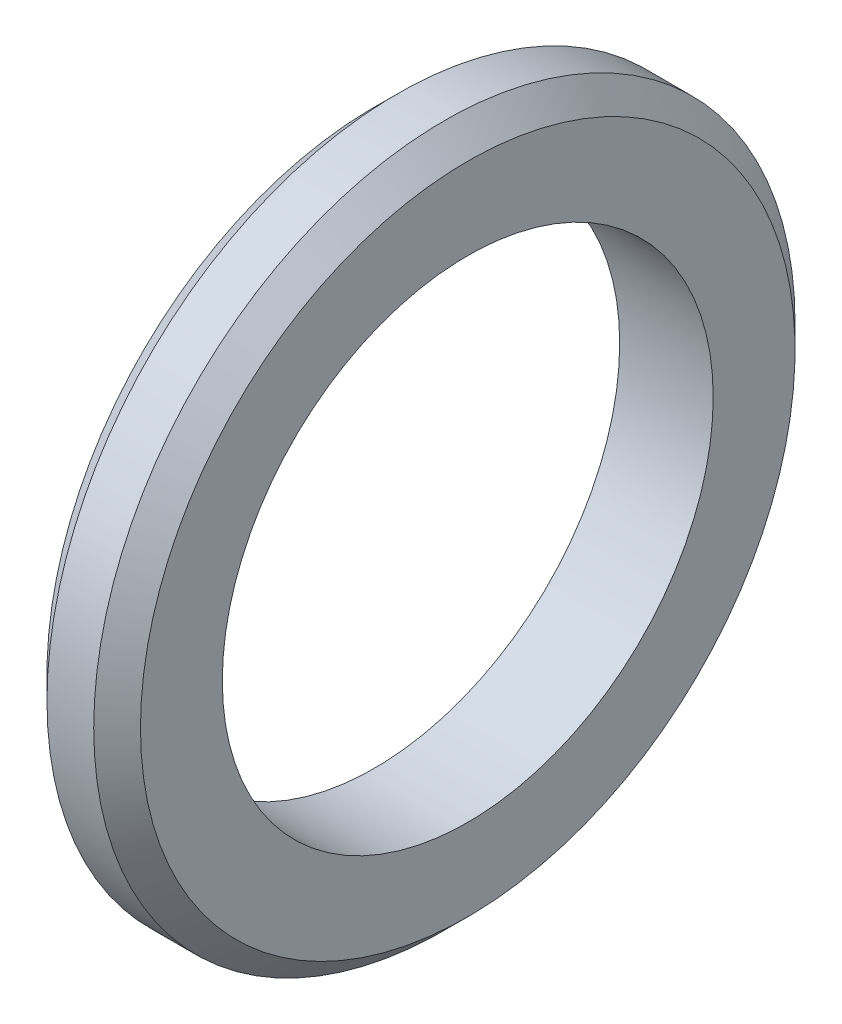
ISO-10303-21;
HEADER;
FILE_DESCRIPTION(('STEP AP214'),'2;1');
FILE_NAME('part.step','',(''),(''),'','','');
FILE_SCHEMA(('AUTOMOTIVE_DESIGN { 1 0 10303 214 1 1 1 1 }'));
ENDSEC;
DATA;
#1=APPLICATION_CONTEXT('core data for automotive mechanical design processes');
#2=APPLICATION_PROTOCOL_DEFINITION('international standard','automotive_design',2000,#1);
#3=PRODUCT_CONTEXT('',#1,'mechanical');
#4=PRODUCT('Part','Part','',(#3));
#5=PRODUCT_RELATED_PRODUCT_CATEGORY('part','',(#4));
#6=PRODUCT_DEFINITION_FORMATION('','',#4);
#7=PRODUCT_DEFINITION_CONTEXT('part definition',#1,'design');
#8=PRODUCT_DEFINITION('design','',#6,#7);
#9=PRODUCT_DEFINITION_SHAPE('','',#8);
#10=(LENGTH_UNIT() NAMED_UNIT(*) SI_UNIT(.MILLI.,.METRE.));
#11=(NAMED_UNIT(*) PLANE_ANGLE_UNIT() SI_UNIT($,.RADIAN.));
#12=(NAMED_UNIT(*) SI_UNIT($,.STERADIAN.) SOLID_ANGLE_UNIT());
#13=UNCERTAINTY_MEASURE_WITH_UNIT(LENGTH_MEASURE(1.E-05),#10,'distance_accuracy_value','');
#14=(GEOMETRIC_REPRESENTATION_CONTEXT(3) GLOBAL_UNCERTAINTY_ASSIGNED_CONTEXT((#13)) GLOBAL_UNIT_ASSIGNED_CONTEXT((#10,
#11,#12)) REPRESENTATION_CONTEXT('',''));
#15=CARTESIAN_POINT('',(0.,0.,0.));
#16=DIRECTION('',(0.,0.,1.));
#17=DIRECTION('',(1.,0.,0.));
#18=AXIS2_PLACEMENT_3D('',#15,#16,#17);
#19=CARTESIAN_POINT('',(25.4,-177.8254,177.8254));
#20=DIRECTION('',(1.,0.,0.));
#21=DIRECTION('',(0.,0.,-1.));
#22=AXIS2_PLACEMENT_3D('',#19,#20,#21);
#23=PLANE('',#22);
#24=CARTESIAN_POINT('',(25.4,0.,0.));
#25=DIRECTION('',(1.,0.,0.));
#26=DIRECTION('',(0.,0.,-1.));
#27=AXIS2_PLACEMENT_3D('',#24,#25,#26);
#28=CIRCLE('',#27,133.35);
#29=CARTESIAN_POINT('',(25.4,0.,-133.35));
#30=VERTEX_POINT('',#29);
#31=EDGE_CURVE('E16',#30,#30,#28,.T.);
#32=ORIENTED_EDGE('',*,*,#31,.F.);
#33=EDGE_LOOP('',(#32));
#34=FACE_BOUND('',#33,.T.);
#35=CARTESIAN_POINT('',(25.4,0.,0.));
#36=DIRECTION('',(-1.,0.,0.));
#37=DIRECTION('',(0.,0.,1.));
#38=AXIS2_PLACEMENT_3D('',#35,#36,#37);
#39=CIRCLE('',#38,177.8);
#40=CARTESIAN_POINT('',(25.4,0.,177.8));
#41=VERTEX_POINT('',#40);
#42=EDGE_CURVE('E32',#41,#41,#39,.T.);
#43=ORIENTED_EDGE('',*,*,#42,.F.);
#44=EDGE_LOOP('',(#43));
#45=FACE_BOUND('',#44,.T.);
#46=ADVANCED_FACE('F12',(#34,#45),#23,.T.);
#47=CARTESIAN_POINT('',(-25.4,0.,0.));
#48=DIRECTION('',(1.,0.,0.));
#49=DIRECTION('',(0.,0.,-1.));
#50=AXIS2_PLACEMENT_3D('',#47,#48,#49);
#51=CYLINDRICAL_SURFACE('',#50,133.35);
#52=CARTESIAN_POINT('',(-25.4,0.,0.));
#53=DIRECTION('',(1.,0.,0.));
#54=DIRECTION('',(0.,0.,-1.));
#55=AXIS2_PLACEMENT_3D('',#52,#53,#54);
#56=CIRCLE('',#55,133.35);
#57=CARTESIAN_POINT('',(-25.4,0.,-133.35));
#58=VERTEX_POINT('',#57);
#59=EDGE_CURVE('E29',#58,#58,#56,.T.);
#60=ORIENTED_EDGE('',*,*,#59,.F.);
#61=EDGE_LOOP('',(#60));
#62=FACE_BOUND('',#61,.T.);
#63=ORIENTED_EDGE('',*,*,#31,.T.);
#64=EDGE_LOOP('',(#63));
#65=FACE_BOUND('',#64,.T.);
#66=ADVANCED_FACE('F39',(#62,#65),#51,.F.);
#67=CARTESIAN_POINT('',(12.7,0.,0.));
#68=DIRECTION('',(-1.,0.,0.));
#69=DIRECTION('',(0.,0.,1.));
#70=AXIS2_PLACEMENT_3D('',#67,#68,#69);
#71=CONICAL_SURFACE('',#70,190.5,0.78539816339745);
#72=CARTESIAN_POINT('',(12.7,0.,0.));
#73=DIRECTION('',(-1.,0.,0.));
#74=DIRECTION('',(0.,0.,1.));
#75=AXIS2_PLACEMENT_3D('',#72,#73,#74);
#76=CIRCLE('',#75,190.5);
#77=CARTESIAN_POINT('',(12.7,0.,190.5));
#78=VERTEX_POINT('',#77);
#79=EDGE_CURVE('E25',#78,#78,#76,.T.);
#80=ORIENTED_EDGE('',*,*,#79,.F.);
#81=EDGE_LOOP('',(#80));
#82=FACE_BOUND('',#81,.T.);
#83=ORIENTED_EDGE('',*,*,#42,.T.);
#84=EDGE_LOOP('',(#83));
#85=FACE_BOUND('',#84,.T.);
#86=ADVANCED_FACE('F48',(#82,#85),#71,.T.);
#87=CARTESIAN_POINT('',(-25.4,-177.8254,-177.8254));
#88=DIRECTION('',(-1.,0.,0.));
#89=DIRECTION('',(0.,0.,1.));
#90=AXIS2_PLACEMENT_3D('',#87,#88,#89);
#91=PLANE('',#90);
#92=ORIENTED_EDGE('',*,*,#59,.T.);
#93=EDGE_LOOP('',(#92));
#94=FACE_BOUND('',#93,.T.);
#95=CARTESIAN_POINT('',(-25.4,0.,0.));
#96=DIRECTION('',(1.,0.,0.));
#97=DIRECTION('',(0.,0.,-1.));
#98=AXIS2_PLACEMENT_3D('',#95,#96,#97);
#99=CIRCLE('',#98,177.8);
#100=CARTESIAN_POINT('',(-25.4,0.,-177.8));
#101=VERTEX_POINT('',#100);
#102=EDGE_CURVE('E20',#101,#101,#99,.T.);
#103=ORIENTED_EDGE('',*,*,#102,.F.);
#104=EDGE_LOOP('',(#103));
#105=FACE_BOUND('',#104,.T.);
#106=ADVANCED_FACE('F57',(#94,#105),#91,.T.);
#107=CARTESIAN_POINT('',(12.7,0.,0.));
#108=DIRECTION('',(-1.,0.,0.));
#109=DIRECTION('',(0.,0.,1.));
#110=AXIS2_PLACEMENT_3D('',#107,#108,#109);
#111=CYLINDRICAL_SURFACE('',#110,190.5);
#112=CARTESIAN_POINT('',(-12.7,0.,0.));
#113=DIRECTION('',(-1.,0.,0.));
#114=DIRECTION('',(0.,0.,1.));
#115=AXIS2_PLACEMENT_3D('',#112,#113,#114);
#116=CIRCLE('',#115,190.5);
#117=CARTESIAN_POINT('',(-12.7,0.,190.5));
#118=VERTEX_POINT('',#117);
#119=EDGE_CURVE('E8',#118,#118,#116,.T.);
#120=ORIENTED_EDGE('',*,*,#119,.F.);
#121=EDGE_LOOP('',(#120));
#122=FACE_BOUND('',#121,.T.);
#123=ORIENTED_EDGE('',*,*,#79,.T.);
#124=EDGE_LOOP('',(#123));
#125=FACE_BOUND('',#124,.T.);
#126=ADVANCED_FACE('F52',(#122,#125),#111,.T.);
#127=CARTESIAN_POINT('',(-12.7,0.,0.));
#128=DIRECTION('',(1.,0.,0.));
#129=DIRECTION('',(0.,0.,-1.));
#130=AXIS2_PLACEMENT_3D('',#127,#128,#129);
#131=CONICAL_SURFACE('',#130,190.5,0.78539816339745);
#132=ORIENTED_EDGE('',*,*,#119,.T.);
#133=EDGE_LOOP('',(#132));
#134=FACE_BOUND('',#133,.T.);
#135=ORIENTED_EDGE('',*,*,#102,.T.);
#136=EDGE_LOOP('',(#135));
#137=FACE_BOUND('',#136,.T.);
#138=ADVANCED_FACE('F14',(#134,#137),#131,.T.);
#139=CLOSED_SHELL('',(#46,#66,#86,#106,#126,#138));
#140=MANIFOLD_SOLID_BREP('B1',#139);
#141=ADVANCED_BREP_SHAPE_REPRESENTATION('',(#18,#140),#14);
#142=SHAPE_DEFINITION_REPRESENTATION(#9,#141);
ENDSEC;
END-ISO-10303-21;
